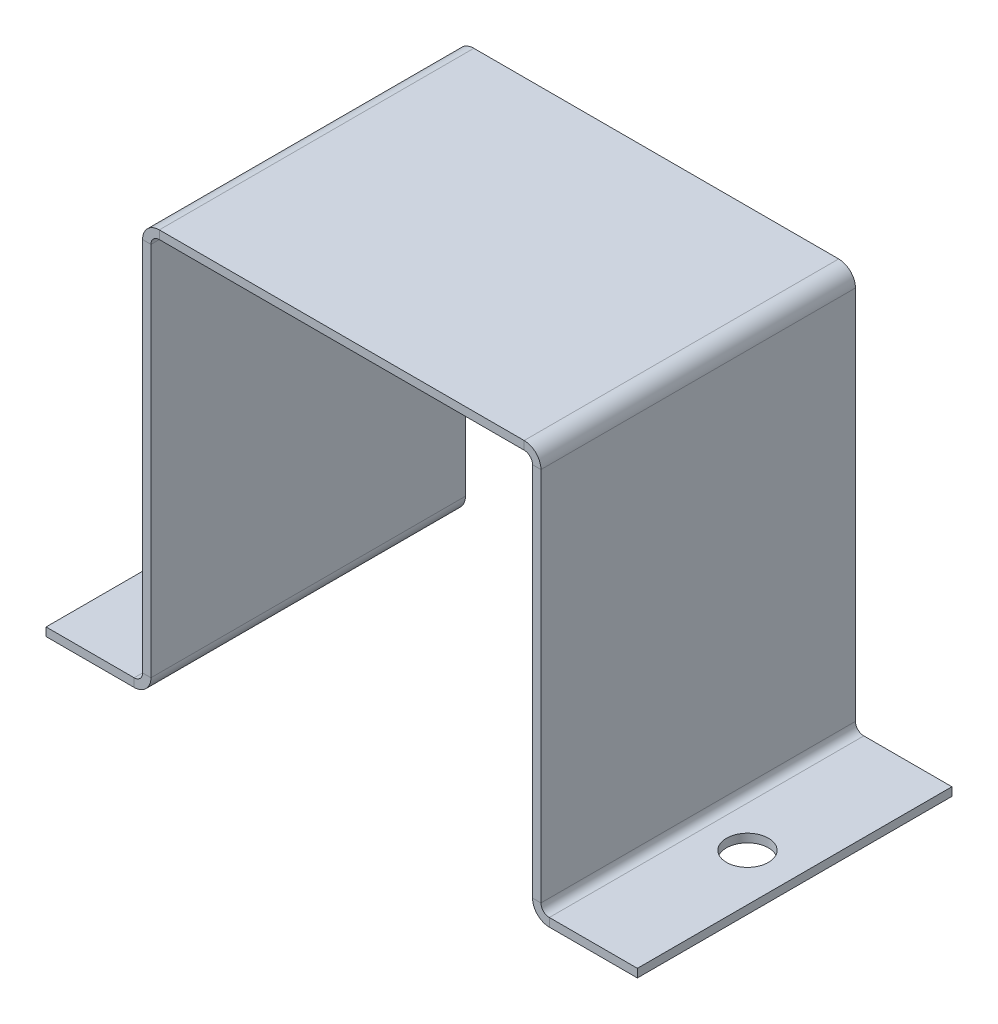
ISO-10303-21;
HEADER;
FILE_DESCRIPTION(('STEP AP214'),'2;1');
FILE_NAME('part.step','',(''),(''),'','','');
FILE_SCHEMA(('AUTOMOTIVE_DESIGN { 1 0 10303 214 1 1 1 1 }'));
ENDSEC;
DATA;
#1=APPLICATION_CONTEXT('core data for automotive mechanical design processes');
#2=APPLICATION_PROTOCOL_DEFINITION('international standard','automotive_design',2000,#1);
#3=PRODUCT_CONTEXT('',#1,'mechanical');
#4=PRODUCT('Part','Part','',(#3));
#5=PRODUCT_RELATED_PRODUCT_CATEGORY('part','',(#4));
#6=PRODUCT_DEFINITION_FORMATION('','',#4);
#7=PRODUCT_DEFINITION_CONTEXT('part definition',#1,'design');
#8=PRODUCT_DEFINITION('design','',#6,#7);
#9=PRODUCT_DEFINITION_SHAPE('','',#8);
#10=(LENGTH_UNIT() NAMED_UNIT(*) SI_UNIT(.MILLI.,.METRE.));
#11=(NAMED_UNIT(*) PLANE_ANGLE_UNIT() SI_UNIT($,.RADIAN.));
#12=(NAMED_UNIT(*) SI_UNIT($,.STERADIAN.) SOLID_ANGLE_UNIT());
#13=UNCERTAINTY_MEASURE_WITH_UNIT(LENGTH_MEASURE(1.E-05),#10,'distance_accuracy_value','');
#14=(GEOMETRIC_REPRESENTATION_CONTEXT(3) GLOBAL_UNCERTAINTY_ASSIGNED_CONTEXT((#13)) GLOBAL_UNIT_ASSIGNED_CONTEXT((#10,
#11,#12)) REPRESENTATION_CONTEXT('',''));
#15=CARTESIAN_POINT('',(0.,0.,0.));
#16=DIRECTION('',(0.,0.,1.));
#17=DIRECTION('',(1.,0.,0.));
#18=AXIS2_PLACEMENT_3D('',#15,#16,#17);
#19=CARTESIAN_POINT('',(19.,-0.799999999999997,-15.));
#20=DIRECTION('',(0.,0.,-1.));
#21=DIRECTION('',(-1.,0.,0.));
#22=AXIS2_PLACEMENT_3D('',#19,#20,#21);
#23=PLANE('',#22);
#24=DIRECTION('',(0.,1.,0.));
#25=VECTOR('',#24,1.);
#26=CARTESIAN_POINT('',(19.,-0.799999999999997,-15.));
#27=LINE('',#26,#25);
#28=CARTESIAN_POINT('',(19.,-1.59999999999999,-15.));
#29=VERTEX_POINT('',#28);
#30=CARTESIAN_POINT('',(19.0000000000001,-37.4,-15.));
#31=VERTEX_POINT('',#30);
#32=EDGE_CURVE('E383',#29,#31,#27,.F.);
#33=ORIENTED_EDGE('',*,*,#32,.T.);
#34=DIRECTION('',(-1.,0.,0.));
#35=VECTOR('',#34,1.);
#36=CARTESIAN_POINT('',(19.0000000000001,-37.4,-15.));
#37=LINE('',#36,#35);
#38=CARTESIAN_POINT('',(18.2000000000001,-37.4,-15.));
#39=VERTEX_POINT('',#38);
#40=EDGE_CURVE('E314',#31,#39,#37,.T.);
#41=ORIENTED_EDGE('',*,*,#40,.T.);
#42=DIRECTION('',(0.,-1.,0.));
#43=VECTOR('',#42,1.);
#44=CARTESIAN_POINT('',(18.2000000000001,-39.,-15.));
#45=LINE('',#44,#43);
#46=CARTESIAN_POINT('',(18.2,-1.6,-15.));
#47=VERTEX_POINT('',#46);
#48=EDGE_CURVE('E388',#47,#39,#45,.T.);
#49=ORIENTED_EDGE('',*,*,#48,.F.);
#50=DIRECTION('',(1.,0.,0.));
#51=VECTOR('',#50,1.);
#52=CARTESIAN_POINT('',(19.,-1.59999999999999,-15.));
#53=LINE('',#52,#51);
#54=EDGE_CURVE('E378',#47,#29,#53,.T.);
#55=ORIENTED_EDGE('',*,*,#54,.T.);
#56=EDGE_LOOP('',(#33,#41,#49,#55));
#57=FACE_BOUND('',#56,.T.);
#58=ADVANCED_FACE('F126',(#57),#23,.T.);
#59=CARTESIAN_POINT('',(19.0000000000001,-39.,-15.));
#60=DIRECTION('',(-1.,0.,0.));
#61=DIRECTION('',(0.,-1.,0.));
#62=AXIS2_PLACEMENT_3D('',#59,#60,#61);
#63=PLANE('',#62);
#64=DIRECTION('',(0.,0.,-1.));
#65=VECTOR('',#64,1.);
#66=CARTESIAN_POINT('',(19.0000000000001,-37.4,-15.));
#67=LINE('',#66,#65);
#68=CARTESIAN_POINT('',(19.0000000000001,-37.4,15.));
#69=VERTEX_POINT('',#68);
#70=EDGE_CURVE('E320',#31,#69,#67,.F.);
#71=ORIENTED_EDGE('',*,*,#70,.F.);
#72=ORIENTED_EDGE('',*,*,#32,.F.);
#73=DIRECTION('',(0.,0.,1.));
#74=VECTOR('',#73,1.);
#75=CARTESIAN_POINT('',(19.,-1.59999999999999,-15.));
#76=LINE('',#75,#74);
#77=CARTESIAN_POINT('',(19.,-1.59999999999999,15.));
#78=VERTEX_POINT('',#77);
#79=EDGE_CURVE('E391',#78,#29,#76,.F.);
#80=ORIENTED_EDGE('',*,*,#79,.F.);
#81=DIRECTION('',(0.,-1.,0.));
#82=VECTOR('',#81,1.);
#83=CARTESIAN_POINT('',(19.0000000000001,-39.,15.));
#84=LINE('',#83,#82);
#85=EDGE_CURVE('E380',#69,#78,#84,.F.);
#86=ORIENTED_EDGE('',*,*,#85,.F.);
#87=EDGE_LOOP('',(#71,#72,#80,#86));
#88=FACE_BOUND('',#87,.T.);
#89=ADVANCED_FACE('F494',(#88),#63,.F.);
#90=CARTESIAN_POINT('',(18.2000000000001,-39.,-15.));
#91=DIRECTION('',(-1.,0.,0.));
#92=DIRECTION('',(0.,-1.,0.));
#93=AXIS2_PLACEMENT_3D('',#90,#91,#92);
#94=PLANE('',#93);
#95=ORIENTED_EDGE('',*,*,#48,.T.);
#96=DIRECTION('',(0.,0.,-1.));
#97=VECTOR('',#96,1.);
#98=CARTESIAN_POINT('',(18.2000000000001,-37.4,-15.));
#99=LINE('',#98,#97);
#100=CARTESIAN_POINT('',(18.2000000000001,-37.4,15.));
#101=VERTEX_POINT('',#100);
#102=EDGE_CURVE('E309',#39,#101,#99,.F.);
#103=ORIENTED_EDGE('',*,*,#102,.T.);
#104=DIRECTION('',(0.,1.,0.));
#105=VECTOR('',#104,1.);
#106=CARTESIAN_POINT('',(18.2000000000001,-39.,15.));
#107=LINE('',#106,#105);
#108=CARTESIAN_POINT('',(18.2,-1.6,15.));
#109=VERTEX_POINT('',#108);
#110=EDGE_CURVE('E386',#101,#109,#107,.T.);
#111=ORIENTED_EDGE('',*,*,#110,.T.);
#112=DIRECTION('',(0.,0.,1.));
#113=VECTOR('',#112,1.);
#114=CARTESIAN_POINT('',(18.2,-1.6,-15.));
#115=LINE('',#114,#113);
#116=EDGE_CURVE('E396',#47,#109,#115,.T.);
#117=ORIENTED_EDGE('',*,*,#116,.F.);
#118=EDGE_LOOP('',(#95,#103,#111,#117));
#119=FACE_BOUND('',#118,.T.);
#120=ADVANCED_FACE('F502',(#119),#94,.T.);
#121=CARTESIAN_POINT('',(-19.0000000000001,-39.,15.));
#122=DIRECTION('',(0.,0.,1.));
#123=DIRECTION('',(1.,0.,0.));
#124=AXIS2_PLACEMENT_3D('',#121,#122,#123);
#125=PLANE('',#124);
#126=DIRECTION('',(0.,-1.,0.));
#127=VECTOR('',#126,1.);
#128=CARTESIAN_POINT('',(-19.0000000000001,-39.,15.));
#129=LINE('',#128,#127);
#130=CARTESIAN_POINT('',(-19.,-1.59999999999999,15.));
#131=VERTEX_POINT('',#130);
#132=CARTESIAN_POINT('',(-19.0000000000001,-37.4,15.));
#133=VERTEX_POINT('',#132);
#134=EDGE_CURVE('E427',#131,#133,#129,.T.);
#135=ORIENTED_EDGE('',*,*,#134,.T.);
#136=DIRECTION('',(1.,0.,0.));
#137=VECTOR('',#136,1.);
#138=CARTESIAN_POINT('',(-19.0000000000001,-37.4,15.));
#139=LINE('',#138,#137);
#140=CARTESIAN_POINT('',(-18.2000000000001,-37.4,15.));
#141=VERTEX_POINT('',#140);
#142=EDGE_CURVE('E366',#133,#141,#139,.T.);
#143=ORIENTED_EDGE('',*,*,#142,.T.);
#144=DIRECTION('',(0.,1.,0.));
#145=VECTOR('',#144,1.);
#146=CARTESIAN_POINT('',(-18.2,-0.8,15.));
#147=LINE('',#146,#145);
#148=CARTESIAN_POINT('',(-18.2,-1.6,15.));
#149=VERTEX_POINT('',#148);
#150=EDGE_CURVE('E432',#149,#141,#147,.F.);
#151=ORIENTED_EDGE('',*,*,#150,.F.);
#152=DIRECTION('',(-1.,0.,0.));
#153=VECTOR('',#152,1.);
#154=CARTESIAN_POINT('',(-19.,-1.6,15.));
#155=LINE('',#154,#153);
#156=EDGE_CURVE('E421',#149,#131,#155,.T.);
#157=ORIENTED_EDGE('',*,*,#156,.T.);
#158=EDGE_LOOP('',(#135,#143,#151,#157));
#159=FACE_BOUND('',#158,.T.);
#160=ADVANCED_FACE('F525',(#159),#125,.T.);
#161=CARTESIAN_POINT('',(-19.,-0.799999999999997,-15.));
#162=DIRECTION('',(-1.,0.,0.));
#163=DIRECTION('',(0.,-1.,0.));
#164=AXIS2_PLACEMENT_3D('',#161,#162,#163);
#165=PLANE('',#164);
#166=DIRECTION('',(0.,1.,0.));
#167=VECTOR('',#166,1.);
#168=CARTESIAN_POINT('',(-19.,-0.799999999999997,-15.));
#169=LINE('',#168,#167);
#170=CARTESIAN_POINT('',(-19.0000000000001,-37.4,-15.));
#171=VERTEX_POINT('',#170);
#172=CARTESIAN_POINT('',(-19.,-1.59999999999999,-15.));
#173=VERTEX_POINT('',#172);
#174=EDGE_CURVE('E424',#171,#173,#169,.T.);
#175=ORIENTED_EDGE('',*,*,#174,.F.);
#176=DIRECTION('',(0.,0.,1.));
#177=VECTOR('',#176,1.);
#178=CARTESIAN_POINT('',(-19.0000000000001,-37.4,15.));
#179=LINE('',#178,#177);
#180=EDGE_CURVE('E372',#133,#171,#179,.F.);
#181=ORIENTED_EDGE('',*,*,#180,.F.);
#182=ORIENTED_EDGE('',*,*,#134,.F.);
#183=DIRECTION('',(0.,0.,-1.));
#184=VECTOR('',#183,1.);
#185=CARTESIAN_POINT('',(-19.,-1.59999999999999,-15.));
#186=LINE('',#185,#184);
#187=EDGE_CURVE('E435',#131,#173,#186,.T.);
#188=ORIENTED_EDGE('',*,*,#187,.T.);
#189=EDGE_LOOP('',(#175,#181,#182,#188));
#190=FACE_BOUND('',#189,.T.);
#191=ADVANCED_FACE('F589',(#190),#165,.T.);
#192=CARTESIAN_POINT('',(-18.2,-0.8,-15.));
#193=DIRECTION('',(-1.,0.,0.));
#194=DIRECTION('',(0.,-1.,0.));
#195=AXIS2_PLACEMENT_3D('',#192,#193,#194);
#196=PLANE('',#195);
#197=DIRECTION('',(0.,0.,1.));
#198=VECTOR('',#197,1.);
#199=CARTESIAN_POINT('',(-18.2000000000001,-37.4,15.));
#200=LINE('',#199,#198);
#201=CARTESIAN_POINT('',(-18.2000000000001,-37.4,-15.));
#202=VERTEX_POINT('',#201);
#203=EDGE_CURVE('E360',#141,#202,#200,.F.);
#204=ORIENTED_EDGE('',*,*,#203,.T.);
#205=DIRECTION('',(0.,-1.,0.));
#206=VECTOR('',#205,1.);
#207=CARTESIAN_POINT('',(-18.2,-0.8,-15.));
#208=LINE('',#207,#206);
#209=CARTESIAN_POINT('',(-18.2,-1.6,-15.));
#210=VERTEX_POINT('',#209);
#211=EDGE_CURVE('E430',#202,#210,#208,.F.);
#212=ORIENTED_EDGE('',*,*,#211,.T.);
#213=DIRECTION('',(0.,0.,1.));
#214=VECTOR('',#213,1.);
#215=CARTESIAN_POINT('',(-18.2,-1.6,15.));
#216=LINE('',#215,#214);
#217=EDGE_CURVE('E441',#149,#210,#216,.F.);
#218=ORIENTED_EDGE('',*,*,#217,.F.);
#219=ORIENTED_EDGE('',*,*,#150,.T.);
#220=EDGE_LOOP('',(#204,#212,#218,#219));
#221=FACE_BOUND('',#220,.T.);
#222=ADVANCED_FACE('F522',(#221),#196,.F.);
#223=CARTESIAN_POINT('',(19.,-0.8,-15.));
#224=DIRECTION('',(0.,-1.,0.));
#225=DIRECTION('',(0.,0.,-1.));
#226=AXIS2_PLACEMENT_3D('',#223,#224,#225);
#227=PLANE('',#226);
#228=DIRECTION('',(-1.,0.,0.));
#229=VECTOR('',#228,1.);
#230=CARTESIAN_POINT('',(-19.,-0.8,-15.));
#231=LINE('',#230,#229);
#232=CARTESIAN_POINT('',(17.4,-0.800000000000002,-15.));
#233=VERTEX_POINT('',#232);
#234=CARTESIAN_POINT('',(-17.4,-0.8,-15.));
#235=VERTEX_POINT('',#234);
#236=EDGE_CURVE('E135',#233,#235,#231,.T.);
#237=ORIENTED_EDGE('',*,*,#236,.F.);
#238=DIRECTION('',(0.,0.,1.));
#239=VECTOR('',#238,1.);
#240=CARTESIAN_POINT('',(17.4,-0.800000000000002,15.));
#241=LINE('',#240,#239);
#242=CARTESIAN_POINT('',(17.4,-0.800000000000002,15.));
#243=VERTEX_POINT('',#242);
#244=EDGE_CURVE('E413',#243,#233,#241,.F.);
#245=ORIENTED_EDGE('',*,*,#244,.F.);
#246=DIRECTION('',(1.,0.,0.));
#247=VECTOR('',#246,1.);
#248=CARTESIAN_POINT('',(-19.,-0.8,15.));
#249=LINE('',#248,#247);
#250=CARTESIAN_POINT('',(-17.4,-0.8,15.));
#251=VERTEX_POINT('',#250);
#252=EDGE_CURVE('E15',#251,#243,#249,.T.);
#253=ORIENTED_EDGE('',*,*,#252,.F.);
#254=DIRECTION('',(0.,0.,-1.));
#255=VECTOR('',#254,1.);
#256=CARTESIAN_POINT('',(-17.4,-0.800000000000002,-15.));
#257=LINE('',#256,#255);
#258=EDGE_CURVE('E458',#235,#251,#257,.F.);
#259=ORIENTED_EDGE('',*,*,#258,.F.);
#260=EDGE_LOOP('',(#237,#245,#253,#259));
#261=FACE_BOUND('',#260,.T.);
#262=ADVANCED_FACE('F507',(#261),#227,.T.);
#263=CARTESIAN_POINT('',(19.,0.,-15.));
#264=DIRECTION('',(0.,-1.,0.));
#265=DIRECTION('',(0.,0.,-1.));
#266=AXIS2_PLACEMENT_3D('',#263,#264,#265);
#267=PLANE('',#266);
#268=DIRECTION('',(0.,0.,1.));
#269=VECTOR('',#268,1.);
#270=CARTESIAN_POINT('',(17.4,0.,15.));
#271=LINE('',#270,#269);
#272=CARTESIAN_POINT('',(17.4,0.,15.));
#273=VERTEX_POINT('',#272);
#274=CARTESIAN_POINT('',(17.4,0.,-15.));
#275=VERTEX_POINT('',#274);
#276=EDGE_CURVE('E401',#273,#275,#271,.F.);
#277=ORIENTED_EDGE('',*,*,#276,.T.);
#278=DIRECTION('',(-1.,0.,0.));
#279=VECTOR('',#278,1.);
#280=CARTESIAN_POINT('',(-19.,0.,-15.));
#281=LINE('',#280,#279);
#282=CARTESIAN_POINT('',(-17.4,0.,-15.));
#283=VERTEX_POINT('',#282);
#284=EDGE_CURVE('E466',#275,#283,#281,.T.);
#285=ORIENTED_EDGE('',*,*,#284,.T.);
#286=DIRECTION('',(0.,0.,-1.));
#287=VECTOR('',#286,1.);
#288=CARTESIAN_POINT('',(-17.4,0.,-15.));
#289=LINE('',#288,#287);
#290=CARTESIAN_POINT('',(-17.4,0.,15.));
#291=VERTEX_POINT('',#290);
#292=EDGE_CURVE('E446',#283,#291,#289,.F.);
#293=ORIENTED_EDGE('',*,*,#292,.T.);
#294=DIRECTION('',(1.,0.,0.));
#295=VECTOR('',#294,1.);
#296=CARTESIAN_POINT('',(-19.,0.,15.));
#297=LINE('',#296,#295);
#298=EDGE_CURVE('E130',#291,#273,#297,.T.);
#299=ORIENTED_EDGE('',*,*,#298,.T.);
#300=EDGE_LOOP('',(#277,#285,#293,#299));
#301=FACE_BOUND('',#300,.T.);
#302=ADVANCED_FACE('F473',(#301),#267,.F.);
#303=CARTESIAN_POINT('',(-19.,-0.8,15.));
#304=DIRECTION('',(0.,0.,1.));
#305=DIRECTION('',(1.,0.,0.));
#306=AXIS2_PLACEMENT_3D('',#303,#304,#305);
#307=PLANE('',#306);
#308=ORIENTED_EDGE('',*,*,#252,.T.);
#309=DIRECTION('',(0.,1.,0.));
#310=VECTOR('',#309,1.);
#311=CARTESIAN_POINT('',(17.4,-0.800000000000002,15.));
#312=LINE('',#311,#310);
#313=EDGE_CURVE('E407',#243,#273,#312,.T.);
#314=ORIENTED_EDGE('',*,*,#313,.T.);
#315=ORIENTED_EDGE('',*,*,#298,.F.);
#316=DIRECTION('',(0.,1.,0.));
#317=VECTOR('',#316,1.);
#318=CARTESIAN_POINT('',(-17.4,-0.800000000000002,15.));
#319=LINE('',#318,#317);
#320=EDGE_CURVE('E463',#251,#291,#319,.T.);
#321=ORIENTED_EDGE('',*,*,#320,.F.);
#322=EDGE_LOOP('',(#308,#314,#315,#321));
#323=FACE_BOUND('',#322,.T.);
#324=ADVANCED_FACE('F477',(#323),#307,.T.);
#325=CARTESIAN_POINT('',(-19.,-0.8,-15.));
#326=DIRECTION('',(0.,0.,-1.));
#327=DIRECTION('',(-1.,0.,0.));
#328=AXIS2_PLACEMENT_3D('',#325,#326,#327);
#329=PLANE('',#328);
#330=DIRECTION('',(0.,1.,0.));
#331=VECTOR('',#330,1.);
#332=CARTESIAN_POINT('',(17.4,-0.800000000000002,-15.));
#333=LINE('',#332,#331);
#334=EDGE_CURVE('E418',#233,#275,#333,.T.);
#335=ORIENTED_EDGE('',*,*,#334,.F.);
#336=ORIENTED_EDGE('',*,*,#236,.T.);
#337=DIRECTION('',(0.,1.,0.));
#338=VECTOR('',#337,1.);
#339=CARTESIAN_POINT('',(-17.4,-0.800000000000002,-15.));
#340=LINE('',#339,#338);
#341=EDGE_CURVE('E452',#235,#283,#340,.T.);
#342=ORIENTED_EDGE('',*,*,#341,.T.);
#343=ORIENTED_EDGE('',*,*,#284,.F.);
#344=EDGE_LOOP('',(#335,#336,#342,#343));
#345=FACE_BOUND('',#344,.T.);
#346=ADVANCED_FACE('F128',(#345),#329,.T.);
#347=CARTESIAN_POINT('',(-17.4,-1.6,15.));
#348=DIRECTION('',(0.,0.,1.));
#349=DIRECTION('',(1.,0.,0.));
#350=AXIS2_PLACEMENT_3D('',#347,#348,#349);
#351=PLANE('',#350);
#352=ORIENTED_EDGE('',*,*,#156,.F.);
#353=CARTESIAN_POINT('',(-17.4,-1.6,15.));
#354=DIRECTION('',(0.,0.,-1.));
#355=DIRECTION('',(-1.,0.,0.));
#356=AXIS2_PLACEMENT_3D('',#353,#354,#355);
#357=CIRCLE('',#356,0.799999999999999);
#358=EDGE_CURVE('E455',#251,#149,#357,.F.);
#359=ORIENTED_EDGE('',*,*,#358,.F.);
#360=ORIENTED_EDGE('',*,*,#320,.T.);
#361=CARTESIAN_POINT('',(-17.4,-1.6,15.));
#362=DIRECTION('',(0.,0.,-1.));
#363=DIRECTION('',(-1.,0.,0.));
#364=AXIS2_PLACEMENT_3D('',#361,#362,#363);
#365=CIRCLE('',#364,1.6);
#366=EDGE_CURVE('E448',#291,#131,#365,.F.);
#367=ORIENTED_EDGE('',*,*,#366,.T.);
#368=EDGE_LOOP('',(#352,#359,#360,#367));
#369=FACE_BOUND('',#368,.T.);
#370=ADVANCED_FACE('F603',(#369),#351,.T.);
#371=CARTESIAN_POINT('',(-17.4,-1.6,-15.));
#372=DIRECTION('',(0.,0.,1.));
#373=DIRECTION('',(1.,0.,0.));
#374=AXIS2_PLACEMENT_3D('',#371,#372,#373);
#375=PLANE('',#374);
#376=CARTESIAN_POINT('',(-17.4,-1.6,-15.));
#377=DIRECTION('',(0.,0.,-1.));
#378=DIRECTION('',(-1.,0.,0.));
#379=AXIS2_PLACEMENT_3D('',#376,#377,#378);
#380=CIRCLE('',#379,0.799999999999999);
#381=EDGE_CURVE('E426',#210,#235,#380,.T.);
#382=ORIENTED_EDGE('',*,*,#381,.F.);
#383=DIRECTION('',(-1.,0.,0.));
#384=VECTOR('',#383,1.);
#385=CARTESIAN_POINT('',(-18.2,-1.6,-15.));
#386=LINE('',#385,#384);
#387=EDGE_CURVE('E438',#210,#173,#386,.T.);
#388=ORIENTED_EDGE('',*,*,#387,.T.);
#389=CARTESIAN_POINT('',(-17.4,-1.6,-15.));
#390=DIRECTION('',(0.,0.,-1.));
#391=DIRECTION('',(-1.,0.,0.));
#392=AXIS2_PLACEMENT_3D('',#389,#390,#391);
#393=CIRCLE('',#392,1.6);
#394=EDGE_CURVE('E449',#173,#283,#393,.T.);
#395=ORIENTED_EDGE('',*,*,#394,.T.);
#396=ORIENTED_EDGE('',*,*,#341,.F.);
#397=EDGE_LOOP('',(#382,#388,#395,#396));
#398=FACE_BOUND('',#397,.T.);
#399=ADVANCED_FACE('F513',(#398),#375,.F.);
#400=CARTESIAN_POINT('',(-17.4,-1.6,-15.));
#401=DIRECTION('',(0.,0.,-1.));
#402=DIRECTION('',(-1.,0.,0.));
#403=AXIS2_PLACEMENT_3D('',#400,#401,#402);
#404=CYLINDRICAL_SURFACE('',#403,1.6);
#405=ORIENTED_EDGE('',*,*,#292,.F.);
#406=ORIENTED_EDGE('',*,*,#394,.F.);
#407=ORIENTED_EDGE('',*,*,#187,.F.);
#408=ORIENTED_EDGE('',*,*,#366,.F.);
#409=EDGE_LOOP('',(#405,#406,#407,#408));
#410=FACE_BOUND('',#409,.T.);
#411=ADVANCED_FACE('F599',(#410),#404,.T.);
#412=CARTESIAN_POINT('',(-17.4,-1.6,-15.));
#413=DIRECTION('',(0.,0.,-1.));
#414=DIRECTION('',(-1.,0.,0.));
#415=AXIS2_PLACEMENT_3D('',#412,#413,#414);
#416=CYLINDRICAL_SURFACE('',#415,0.799999999999999);
#417=ORIENTED_EDGE('',*,*,#258,.T.);
#418=ORIENTED_EDGE('',*,*,#358,.T.);
#419=ORIENTED_EDGE('',*,*,#217,.T.);
#420=ORIENTED_EDGE('',*,*,#381,.T.);
#421=EDGE_LOOP('',(#417,#418,#419,#420));
#422=FACE_BOUND('',#421,.T.);
#423=ADVANCED_FACE('F517',(#422),#416,.F.);
#424=CARTESIAN_POINT('',(-19.,-0.799999999999997,-15.));
#425=DIRECTION('',(0.,0.,-1.));
#426=DIRECTION('',(-1.,0.,0.));
#427=AXIS2_PLACEMENT_3D('',#424,#425,#426);
#428=PLANE('',#427);
#429=DIRECTION('',(1.,0.,0.));
#430=VECTOR('',#429,1.);
#431=CARTESIAN_POINT('',(-19.0000000000001,-37.4,-15.));
#432=LINE('',#431,#430);
#433=EDGE_CURVE('E151',#171,#202,#432,.T.);
#434=ORIENTED_EDGE('',*,*,#433,.F.);
#435=ORIENTED_EDGE('',*,*,#174,.T.);
#436=ORIENTED_EDGE('',*,*,#387,.F.);
#437=ORIENTED_EDGE('',*,*,#211,.F.);
#438=EDGE_LOOP('',(#434,#435,#436,#437));
#439=FACE_BOUND('',#438,.T.);
#440=ADVANCED_FACE('F586',(#439),#428,.T.);
#441=CARTESIAN_POINT('',(17.4,-1.6,-15.));
#442=DIRECTION('',(0.,0.,-1.));
#443=DIRECTION('',(-1.,0.,0.));
#444=AXIS2_PLACEMENT_3D('',#441,#442,#443);
#445=PLANE('',#444);
#446=ORIENTED_EDGE('',*,*,#54,.F.);
#447=CARTESIAN_POINT('',(17.4,-1.6,-15.));
#448=DIRECTION('',(0.,0.,1.));
#449=DIRECTION('',(1.,0.,0.));
#450=AXIS2_PLACEMENT_3D('',#447,#448,#449);
#451=CIRCLE('',#450,0.799999999999999);
#452=EDGE_CURVE('E410',#233,#47,#451,.F.);
#453=ORIENTED_EDGE('',*,*,#452,.F.);
#454=ORIENTED_EDGE('',*,*,#334,.T.);
#455=CARTESIAN_POINT('',(17.4,-1.6,-15.));
#456=DIRECTION('',(0.,0.,1.));
#457=DIRECTION('',(1.,0.,0.));
#458=AXIS2_PLACEMENT_3D('',#455,#456,#457);
#459=CIRCLE('',#458,1.6);
#460=EDGE_CURVE('E403',#275,#29,#459,.F.);
#461=ORIENTED_EDGE('',*,*,#460,.T.);
#462=EDGE_LOOP('',(#446,#453,#454,#461));
#463=FACE_BOUND('',#462,.T.);
#464=ADVANCED_FACE('F496',(#463),#445,.T.);
#465=CARTESIAN_POINT('',(17.4,-1.6,15.));
#466=DIRECTION('',(0.,0.,-1.));
#467=DIRECTION('',(-1.,0.,0.));
#468=AXIS2_PLACEMENT_3D('',#465,#466,#467);
#469=PLANE('',#468);
#470=CARTESIAN_POINT('',(17.4,-1.6,15.));
#471=DIRECTION('',(0.,0.,1.));
#472=DIRECTION('',(1.,0.,0.));
#473=AXIS2_PLACEMENT_3D('',#470,#471,#472);
#474=CIRCLE('',#473,0.799999999999999);
#475=EDGE_CURVE('E382',#109,#243,#474,.T.);
#476=ORIENTED_EDGE('',*,*,#475,.F.);
#477=DIRECTION('',(1.,0.,0.));
#478=VECTOR('',#477,1.);
#479=CARTESIAN_POINT('',(18.2,-1.6,15.));
#480=LINE('',#479,#478);
#481=EDGE_CURVE('E393',#109,#78,#480,.T.);
#482=ORIENTED_EDGE('',*,*,#481,.T.);
#483=CARTESIAN_POINT('',(17.4,-1.6,15.));
#484=DIRECTION('',(0.,0.,1.));
#485=DIRECTION('',(1.,0.,0.));
#486=AXIS2_PLACEMENT_3D('',#483,#484,#485);
#487=CIRCLE('',#486,1.6);
#488=EDGE_CURVE('E404',#78,#273,#487,.T.);
#489=ORIENTED_EDGE('',*,*,#488,.T.);
#490=ORIENTED_EDGE('',*,*,#313,.F.);
#491=EDGE_LOOP('',(#476,#482,#489,#490));
#492=FACE_BOUND('',#491,.T.);
#493=ADVANCED_FACE('F485',(#492),#469,.F.);
#494=CARTESIAN_POINT('',(17.4,-1.6,15.));
#495=DIRECTION('',(0.,0.,1.));
#496=DIRECTION('',(1.,0.,0.));
#497=AXIS2_PLACEMENT_3D('',#494,#495,#496);
#498=CYLINDRICAL_SURFACE('',#497,1.6);
#499=ORIENTED_EDGE('',*,*,#276,.F.);
#500=ORIENTED_EDGE('',*,*,#488,.F.);
#501=ORIENTED_EDGE('',*,*,#79,.T.);
#502=ORIENTED_EDGE('',*,*,#460,.F.);
#503=EDGE_LOOP('',(#499,#500,#501,#502));
#504=FACE_BOUND('',#503,.T.);
#505=ADVANCED_FACE('F484',(#504),#498,.T.);
#506=CARTESIAN_POINT('',(17.4,-1.6,15.));
#507=DIRECTION('',(0.,0.,1.));
#508=DIRECTION('',(1.,0.,0.));
#509=AXIS2_PLACEMENT_3D('',#506,#507,#508);
#510=CYLINDRICAL_SURFACE('',#509,0.799999999999999);
#511=ORIENTED_EDGE('',*,*,#244,.T.);
#512=ORIENTED_EDGE('',*,*,#452,.T.);
#513=ORIENTED_EDGE('',*,*,#116,.T.);
#514=ORIENTED_EDGE('',*,*,#475,.T.);
#515=EDGE_LOOP('',(#511,#512,#513,#514));
#516=FACE_BOUND('',#515,.T.);
#517=ADVANCED_FACE('F504',(#516),#510,.F.);
#518=CARTESIAN_POINT('',(19.0000000000001,-39.,15.));
#519=DIRECTION('',(0.,0.,1.));
#520=DIRECTION('',(1.,0.,0.));
#521=AXIS2_PLACEMENT_3D('',#518,#519,#520);
#522=PLANE('',#521);
#523=DIRECTION('',(-1.,0.,0.));
#524=VECTOR('',#523,1.);
#525=CARTESIAN_POINT('',(19.0000000000001,-37.4,15.));
#526=LINE('',#525,#524);
#527=EDGE_CURVE('E325',#69,#101,#526,.T.);
#528=ORIENTED_EDGE('',*,*,#527,.F.);
#529=ORIENTED_EDGE('',*,*,#85,.T.);
#530=ORIENTED_EDGE('',*,*,#481,.F.);
#531=ORIENTED_EDGE('',*,*,#110,.F.);
#532=EDGE_LOOP('',(#528,#529,#530,#531));
#533=FACE_BOUND('',#532,.T.);
#534=ADVANCED_FACE('F561',(#533),#522,.T.);
#535=CARTESIAN_POINT('',(-19.8000000000001,-37.4,-15.));
#536=DIRECTION('',(0.,0.,-1.));
#537=DIRECTION('',(-1.,0.,0.));
#538=AXIS2_PLACEMENT_3D('',#535,#536,#537);
#539=PLANE('',#538);
#540=DIRECTION('',(0.,1.,0.));
#541=VECTOR('',#540,1.);
#542=CARTESIAN_POINT('',(-19.8000000000001,-39.,-15.));
#543=LINE('',#542,#541);
#544=CARTESIAN_POINT('',(-19.8000000000001,-38.2,-15.));
#545=VERTEX_POINT('',#544);
#546=CARTESIAN_POINT('',(-19.8000000000001,-39.,-15.));
#547=VERTEX_POINT('',#546);
#548=EDGE_CURVE('E327',#545,#547,#543,.F.);
#549=ORIENTED_EDGE('',*,*,#548,.F.);
#550=CARTESIAN_POINT('',(-19.8000000000001,-37.4,-15.));
#551=DIRECTION('',(0.,0.,1.));
#552=DIRECTION('',(1.,0.,0.));
#553=AXIS2_PLACEMENT_3D('',#550,#551,#552);
#554=CIRCLE('',#553,0.799999999999995);
#555=EDGE_CURVE('E369',#171,#545,#554,.F.);
#556=ORIENTED_EDGE('',*,*,#555,.F.);
#557=ORIENTED_EDGE('',*,*,#433,.T.);
#558=CARTESIAN_POINT('',(-19.8000000000001,-37.4,-15.));
#559=DIRECTION('',(0.,0.,1.));
#560=DIRECTION('',(1.,0.,0.));
#561=AXIS2_PLACEMENT_3D('',#558,#559,#560);
#562=CIRCLE('',#561,1.59999999999999);
#563=EDGE_CURVE('E362',#202,#547,#562,.F.);
#564=ORIENTED_EDGE('',*,*,#563,.T.);
#565=EDGE_LOOP('',(#549,#556,#557,#564));
#566=FACE_BOUND('',#565,.T.);
#567=ADVANCED_FACE('F559',(#566),#539,.T.);
#568=CARTESIAN_POINT('',(-19.8000000000001,-37.4,15.));
#569=DIRECTION('',(0.,0.,-1.));
#570=DIRECTION('',(-1.,0.,0.));
#571=AXIS2_PLACEMENT_3D('',#568,#569,#570);
#572=PLANE('',#571);
#573=CARTESIAN_POINT('',(-19.8000000000001,-37.4,15.));
#574=DIRECTION('',(0.,0.,1.));
#575=DIRECTION('',(1.,0.,0.));
#576=AXIS2_PLACEMENT_3D('',#573,#574,#575);
#577=CIRCLE('',#576,0.799999999999995);
#578=CARTESIAN_POINT('',(-19.8000000000001,-38.2,15.));
#579=VERTEX_POINT('',#578);
#580=EDGE_CURVE('E333',#579,#133,#577,.T.);
#581=ORIENTED_EDGE('',*,*,#580,.F.);
#582=DIRECTION('',(0.,1.,0.));
#583=VECTOR('',#582,1.);
#584=CARTESIAN_POINT('',(-19.8000000000001,-38.2,15.));
#585=LINE('',#584,#583);
#586=CARTESIAN_POINT('',(-19.8000000000001,-39.,15.));
#587=VERTEX_POINT('',#586);
#588=EDGE_CURVE('E353',#579,#587,#585,.F.);
#589=ORIENTED_EDGE('',*,*,#588,.T.);
#590=CARTESIAN_POINT('',(-19.8000000000001,-37.4,15.));
#591=DIRECTION('',(0.,0.,1.));
#592=DIRECTION('',(1.,0.,0.));
#593=AXIS2_PLACEMENT_3D('',#590,#591,#592);
#594=CIRCLE('',#593,1.59999999999999);
#595=EDGE_CURVE('E363',#587,#141,#594,.T.);
#596=ORIENTED_EDGE('',*,*,#595,.T.);
#597=ORIENTED_EDGE('',*,*,#142,.F.);
#598=EDGE_LOOP('',(#581,#589,#596,#597));
#599=FACE_BOUND('',#598,.T.);
#600=ADVANCED_FACE('F530',(#599),#572,.F.);
#601=CARTESIAN_POINT('',(-19.8000000000001,-37.4,15.));
#602=DIRECTION('',(0.,0.,1.));
#603=DIRECTION('',(0.,-1.,0.));
#604=AXIS2_PLACEMENT_3D('',#601,#602,#603);
#605=CYLINDRICAL_SURFACE('',#604,1.59999999999999);
#606=ORIENTED_EDGE('',*,*,#203,.F.);
#607=ORIENTED_EDGE('',*,*,#595,.F.);
#608=DIRECTION('',(0.,0.,1.));
#609=VECTOR('',#608,1.);
#610=CARTESIAN_POINT('',(-19.8000000000001,-39.,-15.));
#611=LINE('',#610,#609);
#612=EDGE_CURVE('E351',#587,#547,#611,.F.);
#613=ORIENTED_EDGE('',*,*,#612,.T.);
#614=ORIENTED_EDGE('',*,*,#563,.F.);
#615=EDGE_LOOP('',(#606,#607,#613,#614));
#616=FACE_BOUND('',#615,.T.);
#617=ADVANCED_FACE('F557',(#616),#605,.T.);
#618=CARTESIAN_POINT('',(-19.8000000000001,-37.4,15.));
#619=DIRECTION('',(0.,0.,1.));
#620=DIRECTION('',(0.,-1.,0.));
#621=AXIS2_PLACEMENT_3D('',#618,#619,#620);
#622=CYLINDRICAL_SURFACE('',#621,0.799999999999995);
#623=ORIENTED_EDGE('',*,*,#180,.T.);
#624=ORIENTED_EDGE('',*,*,#555,.T.);
#625=DIRECTION('',(0.,0.,1.));
#626=VECTOR('',#625,1.);
#627=CARTESIAN_POINT('',(-19.8000000000001,-38.2,-15.));
#628=LINE('',#627,#626);
#629=EDGE_CURVE('E356',#545,#579,#628,.T.);
#630=ORIENTED_EDGE('',*,*,#629,.T.);
#631=ORIENTED_EDGE('',*,*,#580,.T.);
#632=EDGE_LOOP('',(#623,#624,#630,#631));
#633=FACE_BOUND('',#632,.T.);
#634=ADVANCED_FACE('F533',(#633),#622,.F.);
#635=CARTESIAN_POINT('',(-28.2000000000001,-39.,15.));
#636=DIRECTION('',(0.,0.,-1.));
#637=DIRECTION('',(-1.,0.,0.));
#638=AXIS2_PLACEMENT_3D('',#635,#636,#637);
#639=PLANE('',#638);
#640=ORIENTED_EDGE('',*,*,#588,.F.);
#641=DIRECTION('',(1.,0.,0.));
#642=VECTOR('',#641,1.);
#643=CARTESIAN_POINT('',(-28.2000000000001,-38.2,15.));
#644=LINE('',#643,#642);
#645=CARTESIAN_POINT('',(-28.2000000000001,-38.2,15.));
#646=VERTEX_POINT('',#645);
#647=EDGE_CURVE('E349',#579,#646,#644,.F.);
#648=ORIENTED_EDGE('',*,*,#647,.T.);
#649=DIRECTION('',(0.,1.,0.));
#650=VECTOR('',#649,1.);
#651=CARTESIAN_POINT('',(-28.2000000000001,-39.,15.));
#652=LINE('',#651,#650);
#653=CARTESIAN_POINT('',(-28.2000000000001,-39.,15.));
#654=VERTEX_POINT('',#653);
#655=EDGE_CURVE('E330',#654,#646,#652,.T.);
#656=ORIENTED_EDGE('',*,*,#655,.F.);
#657=DIRECTION('',(-1.,0.,0.));
#658=VECTOR('',#657,1.);
#659=CARTESIAN_POINT('',(-19.0000000000001,-39.,15.));
#660=LINE('',#659,#658);
#661=EDGE_CURVE('E342',#587,#654,#660,.T.);
#662=ORIENTED_EDGE('',*,*,#661,.F.);
#663=EDGE_LOOP('',(#640,#648,#656,#662));
#664=FACE_BOUND('',#663,.T.);
#665=ADVANCED_FACE('F551',(#664),#639,.F.);
#666=CARTESIAN_POINT('',(-19.0000000000001,-39.,-15.));
#667=DIRECTION('',(0.,0.,1.));
#668=DIRECTION('',(1.,0.,0.));
#669=AXIS2_PLACEMENT_3D('',#666,#667,#668);
#670=PLANE('',#669);
#671=ORIENTED_EDGE('',*,*,#548,.T.);
#672=DIRECTION('',(1.,0.,0.));
#673=VECTOR('',#672,1.);
#674=CARTESIAN_POINT('',(-19.0000000000001,-39.,-15.));
#675=LINE('',#674,#673);
#676=CARTESIAN_POINT('',(-28.2000000000001,-39.,-15.));
#677=VERTEX_POINT('',#676);
#678=EDGE_CURVE('E337',#677,#547,#675,.T.);
#679=ORIENTED_EDGE('',*,*,#678,.F.);
#680=DIRECTION('',(0.,1.,0.));
#681=VECTOR('',#680,1.);
#682=CARTESIAN_POINT('',(-28.2000000000001,-39.,-15.));
#683=LINE('',#682,#681);
#684=CARTESIAN_POINT('',(-28.2000000000001,-38.2,-15.));
#685=VERTEX_POINT('',#684);
#686=EDGE_CURVE('E334',#677,#685,#683,.T.);
#687=ORIENTED_EDGE('',*,*,#686,.T.);
#688=DIRECTION('',(-1.,0.,0.));
#689=VECTOR('',#688,1.);
#690=CARTESIAN_POINT('',(-19.0000000000001,-38.2,-15.));
#691=LINE('',#690,#689);
#692=EDGE_CURVE('E344',#685,#545,#691,.F.);
#693=ORIENTED_EDGE('',*,*,#692,.T.);
#694=EDGE_LOOP('',(#671,#679,#687,#693));
#695=FACE_BOUND('',#694,.T.);
#696=ADVANCED_FACE('F542',(#695),#670,.F.);
#697=CARTESIAN_POINT('',(-19.0000000000001,-39.,15.));
#698=DIRECTION('',(0.,1.,0.));
#699=DIRECTION('',(0.,0.,1.));
#700=AXIS2_PLACEMENT_3D('',#697,#698,#699);
#701=PLANE('',#700);
#702=CARTESIAN_POINT('',(-23.7000000000001,-39.,0.));
#703=DIRECTION('',(0.,1.,0.));
#704=DIRECTION('',(0.,0.,1.));
#705=AXIS2_PLACEMENT_3D('',#702,#703,#704);
#706=CIRCLE('',#705,2.);
#707=CARTESIAN_POINT('',(-23.7000000000001,-39.,2.));
#708=VERTEX_POINT('',#707);
#709=EDGE_CURVE('E308',#708,#708,#706,.T.);
#710=ORIENTED_EDGE('',*,*,#709,.T.);
#711=EDGE_LOOP('',(#710));
#712=FACE_BOUND('',#711,.T.);
#713=ORIENTED_EDGE('',*,*,#612,.F.);
#714=ORIENTED_EDGE('',*,*,#661,.T.);
#715=DIRECTION('',(0.,0.,-1.));
#716=VECTOR('',#715,1.);
#717=CARTESIAN_POINT('',(-28.2000000000001,-39.,15.));
#718=LINE('',#717,#716);
#719=EDGE_CURVE('E340',#654,#677,#718,.T.);
#720=ORIENTED_EDGE('',*,*,#719,.T.);
#721=ORIENTED_EDGE('',*,*,#678,.T.);
#722=EDGE_LOOP('',(#713,#714,#720,#721));
#723=FACE_BOUND('',#722,.T.);
#724=ADVANCED_FACE('F554',(#712,#723),#701,.F.);
#725=CARTESIAN_POINT('',(-19.0000000000001,-38.2,15.));
#726=DIRECTION('',(0.,1.,0.));
#727=DIRECTION('',(0.,0.,1.));
#728=AXIS2_PLACEMENT_3D('',#725,#726,#727);
#729=PLANE('',#728);
#730=CARTESIAN_POINT('',(-23.7000000000001,-38.2,0.));
#731=DIRECTION('',(0.,1.,0.));
#732=DIRECTION('',(0.,0.,1.));
#733=AXIS2_PLACEMENT_3D('',#730,#731,#732);
#734=CIRCLE('',#733,2.);
#735=CARTESIAN_POINT('',(-23.7000000000001,-38.2,2.));
#736=VERTEX_POINT('',#735);
#737=EDGE_CURVE('E991',#736,#736,#734,.T.);
#738=ORIENTED_EDGE('',*,*,#737,.F.);
#739=EDGE_LOOP('',(#738));
#740=FACE_BOUND('',#739,.T.);
#741=ORIENTED_EDGE('',*,*,#647,.F.);
#742=ORIENTED_EDGE('',*,*,#629,.F.);
#743=ORIENTED_EDGE('',*,*,#692,.F.);
#744=DIRECTION('',(0.,0.,1.));
#745=VECTOR('',#744,1.);
#746=CARTESIAN_POINT('',(-28.2000000000001,-38.2,-15.));
#747=LINE('',#746,#745);
#748=EDGE_CURVE('E347',#646,#685,#747,.F.);
#749=ORIENTED_EDGE('',*,*,#748,.F.);
#750=EDGE_LOOP('',(#741,#742,#743,#749));
#751=FACE_BOUND('',#750,.T.);
#752=ADVANCED_FACE('F539',(#740,#751),#729,.T.);
#753=CARTESIAN_POINT('',(-28.2000000000001,-39.,-15.));
#754=DIRECTION('',(1.,0.,0.));
#755=DIRECTION('',(0.,1.,0.));
#756=AXIS2_PLACEMENT_3D('',#753,#754,#755);
#757=PLANE('',#756);
#758=ORIENTED_EDGE('',*,*,#748,.T.);
#759=ORIENTED_EDGE('',*,*,#686,.F.);
#760=ORIENTED_EDGE('',*,*,#719,.F.);
#761=ORIENTED_EDGE('',*,*,#655,.T.);
#762=EDGE_LOOP('',(#758,#759,#760,#761));
#763=FACE_BOUND('',#762,.T.);
#764=ADVANCED_FACE('F547',(#763),#757,.F.);
#765=CARTESIAN_POINT('',(19.8000000000001,-37.4,15.));
#766=DIRECTION('',(0.,0.,1.));
#767=DIRECTION('',(1.,0.,0.));
#768=AXIS2_PLACEMENT_3D('',#765,#766,#767);
#769=PLANE('',#768);
#770=DIRECTION('',(0.,1.,0.));
#771=VECTOR('',#770,1.);
#772=CARTESIAN_POINT('',(19.8000000000001,-39.,15.));
#773=LINE('',#772,#771);
#774=CARTESIAN_POINT('',(19.8000000000001,-38.2,15.));
#775=VERTEX_POINT('',#774);
#776=CARTESIAN_POINT('',(19.8000000000001,-39.,15.));
#777=VERTEX_POINT('',#776);
#778=EDGE_CURVE('E290',#775,#777,#773,.F.);
#779=ORIENTED_EDGE('',*,*,#778,.F.);
#780=CARTESIAN_POINT('',(19.8000000000001,-37.4,15.));
#781=DIRECTION('',(0.,0.,-1.));
#782=DIRECTION('',(-1.,0.,0.));
#783=AXIS2_PLACEMENT_3D('',#780,#781,#782);
#784=CIRCLE('',#783,0.799999999999995);
#785=EDGE_CURVE('E317',#69,#775,#784,.F.);
#786=ORIENTED_EDGE('',*,*,#785,.F.);
#787=ORIENTED_EDGE('',*,*,#527,.T.);
#788=CARTESIAN_POINT('',(19.8000000000001,-37.4,15.));
#789=DIRECTION('',(0.,0.,-1.));
#790=DIRECTION('',(-1.,0.,0.));
#791=AXIS2_PLACEMENT_3D('',#788,#789,#790);
#792=CIRCLE('',#791,1.59999999999999);
#793=EDGE_CURVE('E143',#101,#777,#792,.F.);
#794=ORIENTED_EDGE('',*,*,#793,.T.);
#795=EDGE_LOOP('',(#779,#786,#787,#794));
#796=FACE_BOUND('',#795,.T.);
#797=ADVANCED_FACE('F720',(#796),#769,.T.);
#798=CARTESIAN_POINT('',(19.8000000000001,-37.4,-15.));
#799=DIRECTION('',(0.,0.,1.));
#800=DIRECTION('',(1.,0.,0.));
#801=AXIS2_PLACEMENT_3D('',#798,#799,#800);
#802=PLANE('',#801);
#803=CARTESIAN_POINT('',(19.8000000000001,-37.4,-15.));
#804=DIRECTION('',(0.,0.,-1.));
#805=DIRECTION('',(-1.,0.,0.));
#806=AXIS2_PLACEMENT_3D('',#803,#804,#805);
#807=CIRCLE('',#806,0.799999999999995);
#808=CARTESIAN_POINT('',(19.8000000000001,-38.2,-15.));
#809=VERTEX_POINT('',#808);
#810=EDGE_CURVE('E322',#809,#31,#807,.T.);
#811=ORIENTED_EDGE('',*,*,#810,.F.);
#812=DIRECTION('',(0.,1.,0.));
#813=VECTOR('',#812,1.);
#814=CARTESIAN_POINT('',(19.8000000000001,-38.2,-15.));
#815=LINE('',#814,#813);
#816=CARTESIAN_POINT('',(19.8000000000001,-39.,-15.));
#817=VERTEX_POINT('',#816);
#818=EDGE_CURVE('E302',#809,#817,#815,.F.);
#819=ORIENTED_EDGE('',*,*,#818,.T.);
#820=CARTESIAN_POINT('',(19.8000000000001,-37.4,-15.));
#821=DIRECTION('',(0.,0.,-1.));
#822=DIRECTION('',(-1.,0.,0.));
#823=AXIS2_PLACEMENT_3D('',#820,#821,#822);
#824=CIRCLE('',#823,1.59999999999999);
#825=EDGE_CURVE('E312',#817,#39,#824,.T.);
#826=ORIENTED_EDGE('',*,*,#825,.T.);
#827=ORIENTED_EDGE('',*,*,#40,.F.);
#828=EDGE_LOOP('',(#811,#819,#826,#827));
#829=FACE_BOUND('',#828,.T.);
#830=ADVANCED_FACE('F732',(#829),#802,.F.);
#831=CARTESIAN_POINT('',(19.8000000000001,-37.4,-15.));
#832=DIRECTION('',(0.,0.,-1.));
#833=DIRECTION('',(0.,-1.,0.));
#834=AXIS2_PLACEMENT_3D('',#831,#832,#833);
#835=CYLINDRICAL_SURFACE('',#834,1.59999999999999);
#836=ORIENTED_EDGE('',*,*,#102,.F.);
#837=ORIENTED_EDGE('',*,*,#825,.F.);
#838=DIRECTION('',(0.,0.,-1.));
#839=VECTOR('',#838,1.);
#840=CARTESIAN_POINT('',(19.8000000000001,-39.,15.));
#841=LINE('',#840,#839);
#842=EDGE_CURVE('E300',#817,#777,#841,.F.);
#843=ORIENTED_EDGE('',*,*,#842,.T.);
#844=ORIENTED_EDGE('',*,*,#793,.F.);
#845=EDGE_LOOP('',(#836,#837,#843,#844));
#846=FACE_BOUND('',#845,.T.);
#847=ADVANCED_FACE('F735',(#846),#835,.T.);
#848=CARTESIAN_POINT('',(19.8000000000001,-37.4,-15.));
#849=DIRECTION('',(0.,0.,-1.));
#850=DIRECTION('',(0.,-1.,0.));
#851=AXIS2_PLACEMENT_3D('',#848,#849,#850);
#852=CYLINDRICAL_SURFACE('',#851,0.799999999999995);
#853=ORIENTED_EDGE('',*,*,#70,.T.);
#854=ORIENTED_EDGE('',*,*,#785,.T.);
#855=DIRECTION('',(0.,0.,-1.));
#856=VECTOR('',#855,1.);
#857=CARTESIAN_POINT('',(19.8000000000001,-38.2,15.));
#858=LINE('',#857,#856);
#859=EDGE_CURVE('E305',#775,#809,#858,.T.);
#860=ORIENTED_EDGE('',*,*,#859,.T.);
#861=ORIENTED_EDGE('',*,*,#810,.T.);
#862=EDGE_LOOP('',(#853,#854,#860,#861));
#863=FACE_BOUND('',#862,.T.);
#864=ADVANCED_FACE('F746',(#863),#852,.F.);
#865=CARTESIAN_POINT('',(28.2000000000001,-39.,-15.));
#866=DIRECTION('',(0.,0.,1.));
#867=DIRECTION('',(1.,0.,0.));
#868=AXIS2_PLACEMENT_3D('',#865,#866,#867);
#869=PLANE('',#868);
#870=ORIENTED_EDGE('',*,*,#818,.F.);
#871=DIRECTION('',(-1.,0.,0.));
#872=VECTOR('',#871,1.);
#873=CARTESIAN_POINT('',(28.2000000000001,-38.2,-15.));
#874=LINE('',#873,#872);
#875=CARTESIAN_POINT('',(28.2000000000001,-38.2,-15.));
#876=VERTEX_POINT('',#875);
#877=EDGE_CURVE('E298',#809,#876,#874,.F.);
#878=ORIENTED_EDGE('',*,*,#877,.T.);
#879=DIRECTION('',(0.,1.,0.));
#880=VECTOR('',#879,1.);
#881=CARTESIAN_POINT('',(28.2000000000001,-39.,-15.));
#882=LINE('',#881,#880);
#883=CARTESIAN_POINT('',(28.2000000000001,-39.,-15.));
#884=VERTEX_POINT('',#883);
#885=EDGE_CURVE('E286',#884,#876,#882,.T.);
#886=ORIENTED_EDGE('',*,*,#885,.F.);
#887=DIRECTION('',(1.,0.,0.));
#888=VECTOR('',#887,1.);
#889=CARTESIAN_POINT('',(19.0000000000001,-39.,-15.));
#890=LINE('',#889,#888);
#891=EDGE_CURVE('E273',#817,#884,#890,.T.);
#892=ORIENTED_EDGE('',*,*,#891,.F.);
#893=EDGE_LOOP('',(#870,#878,#886,#892));
#894=FACE_BOUND('',#893,.T.);
#895=ADVANCED_FACE('F764',(#894),#869,.F.);
#896=CARTESIAN_POINT('',(19.0000000000001,-39.,15.));
#897=DIRECTION('',(0.,0.,-1.));
#898=DIRECTION('',(-1.,0.,0.));
#899=AXIS2_PLACEMENT_3D('',#896,#897,#898);
#900=PLANE('',#899);
#901=ORIENTED_EDGE('',*,*,#778,.T.);
#902=DIRECTION('',(-1.,0.,0.));
#903=VECTOR('',#902,1.);
#904=CARTESIAN_POINT('',(19.0000000000001,-39.,15.));
#905=LINE('',#904,#903);
#906=CARTESIAN_POINT('',(28.2000000000001,-39.,15.));
#907=VERTEX_POINT('',#906);
#908=EDGE_CURVE('E271',#907,#777,#905,.T.);
#909=ORIENTED_EDGE('',*,*,#908,.F.);
#910=DIRECTION('',(0.,1.,0.));
#911=VECTOR('',#910,1.);
#912=CARTESIAN_POINT('',(28.2000000000001,-39.,15.));
#913=LINE('',#912,#911);
#914=CARTESIAN_POINT('',(28.2000000000001,-38.2,15.));
#915=VERTEX_POINT('',#914);
#916=EDGE_CURVE('E279',#907,#915,#913,.T.);
#917=ORIENTED_EDGE('',*,*,#916,.T.);
#918=DIRECTION('',(1.,0.,0.));
#919=VECTOR('',#918,1.);
#920=CARTESIAN_POINT('',(19.0000000000001,-38.2,15.));
#921=LINE('',#920,#919);
#922=EDGE_CURVE('E295',#915,#775,#921,.F.);
#923=ORIENTED_EDGE('',*,*,#922,.T.);
#924=EDGE_LOOP('',(#901,#909,#917,#923));
#925=FACE_BOUND('',#924,.T.);
#926=ADVANCED_FACE('F289',(#925),#900,.F.);
#927=CARTESIAN_POINT('',(19.0000000000001,-39.,-15.));
#928=DIRECTION('',(0.,1.,0.));
#929=DIRECTION('',(0.,0.,1.));
#930=AXIS2_PLACEMENT_3D('',#927,#928,#929);
#931=PLANE('',#930);
#932=CARTESIAN_POINT('',(23.7000000000001,-39.,0.));
#933=DIRECTION('',(0.,1.,0.));
#934=DIRECTION('',(0.,0.,1.));
#935=AXIS2_PLACEMENT_3D('',#932,#933,#934);
#936=CIRCLE('',#935,2.);
#937=CARTESIAN_POINT('',(23.7000000000001,-39.,2.));
#938=VERTEX_POINT('',#937);
#939=EDGE_CURVE('E990',#938,#938,#936,.T.);
#940=ORIENTED_EDGE('',*,*,#939,.T.);
#941=EDGE_LOOP('',(#940));
#942=FACE_BOUND('',#941,.T.);
#943=ORIENTED_EDGE('',*,*,#842,.F.);
#944=ORIENTED_EDGE('',*,*,#891,.T.);
#945=DIRECTION('',(0.,0.,1.));
#946=VECTOR('',#945,1.);
#947=CARTESIAN_POINT('',(28.2000000000001,-39.,-15.));
#948=LINE('',#947,#946);
#949=EDGE_CURVE('E266',#884,#907,#948,.T.);
#950=ORIENTED_EDGE('',*,*,#949,.T.);
#951=ORIENTED_EDGE('',*,*,#908,.T.);
#952=EDGE_LOOP('',(#943,#944,#950,#951));
#953=FACE_BOUND('',#952,.T.);
#954=ADVANCED_FACE('F269',(#942,#953),#931,.F.);
#955=CARTESIAN_POINT('',(19.0000000000001,-38.2,-15.));
#956=DIRECTION('',(0.,1.,0.));
#957=DIRECTION('',(0.,0.,1.));
#958=AXIS2_PLACEMENT_3D('',#955,#956,#957);
#959=PLANE('',#958);
#960=CARTESIAN_POINT('',(23.7000000000001,-38.2,0.));
#961=DIRECTION('',(0.,1.,0.));
#962=DIRECTION('',(0.,0.,1.));
#963=AXIS2_PLACEMENT_3D('',#960,#961,#962);
#964=CIRCLE('',#963,2.);
#965=CARTESIAN_POINT('',(23.7000000000001,-38.2,2.));
#966=VERTEX_POINT('',#965);
#967=EDGE_CURVE('E987',#966,#966,#964,.T.);
#968=ORIENTED_EDGE('',*,*,#967,.F.);
#969=EDGE_LOOP('',(#968));
#970=FACE_BOUND('',#969,.T.);
#971=ORIENTED_EDGE('',*,*,#877,.F.);
#972=ORIENTED_EDGE('',*,*,#859,.F.);
#973=ORIENTED_EDGE('',*,*,#922,.F.);
#974=DIRECTION('',(0.,0.,-1.));
#975=VECTOR('',#974,1.);
#976=CARTESIAN_POINT('',(28.2000000000001,-38.2,15.));
#977=LINE('',#976,#975);
#978=EDGE_CURVE('E282',#876,#915,#977,.F.);
#979=ORIENTED_EDGE('',*,*,#978,.F.);
#980=EDGE_LOOP('',(#971,#972,#973,#979));
#981=FACE_BOUND('',#980,.T.);
#982=ADVANCED_FACE('F797',(#970,#981),#959,.T.);
#983=CARTESIAN_POINT('',(28.2000000000001,-39.,15.));
#984=DIRECTION('',(-1.,0.,0.));
#985=DIRECTION('',(0.,-1.,0.));
#986=AXIS2_PLACEMENT_3D('',#983,#984,#985);
#987=PLANE('',#986);
#988=ORIENTED_EDGE('',*,*,#978,.T.);
#989=ORIENTED_EDGE('',*,*,#916,.F.);
#990=ORIENTED_EDGE('',*,*,#949,.F.);
#991=ORIENTED_EDGE('',*,*,#885,.T.);
#992=EDGE_LOOP('',(#988,#989,#990,#991));
#993=FACE_BOUND('',#992,.T.);
#994=ADVANCED_FACE('F280',(#993),#987,.F.);
#995=CARTESIAN_POINT('',(-23.7000000000001,-48.2,0.));
#996=DIRECTION('',(0.,1.,0.));
#997=DIRECTION('',(0.,0.,1.));
#998=AXIS2_PLACEMENT_3D('',#995,#996,#997);
#999=CYLINDRICAL_SURFACE('',#998,2.);
#1000=ORIENTED_EDGE('',*,*,#737,.T.);
#1001=EDGE_LOOP('',(#1000));
#1002=FACE_BOUND('',#1001,.T.);
#1003=ORIENTED_EDGE('',*,*,#709,.F.);
#1004=EDGE_LOOP('',(#1003));
#1005=FACE_BOUND('',#1004,.T.);
#1006=ADVANCED_FACE('F796',(#1002,#1005),#999,.F.);
#1007=CARTESIAN_POINT('',(23.7000000000001,-48.2,0.));
#1008=DIRECTION('',(0.,1.,0.));
#1009=DIRECTION('',(0.,0.,1.));
#1010=AXIS2_PLACEMENT_3D('',#1007,#1008,#1009);
#1011=CYLINDRICAL_SURFACE('',#1010,2.);
#1012=ORIENTED_EDGE('',*,*,#967,.T.);
#1013=EDGE_LOOP('',(#1012));
#1014=FACE_BOUND('',#1013,.T.);
#1015=ORIENTED_EDGE('',*,*,#939,.F.);
#1016=EDGE_LOOP('',(#1015));
#1017=FACE_BOUND('',#1016,.T.);
#1018=ADVANCED_FACE('F841',(#1014,#1017),#1011,.F.);
#1019=CLOSED_SHELL('',(#58,#89,#120,#160,#191,#222,#262,#302,#324,#346,#370,#399,#411,#423,#440,
#464,#493,#505,#517,#534,#567,#600,#617,#634,#665,#696,#724,#752,#764,#797,#830,#847,#864,#895,
#926,#954,#982,#994,#1006,#1018));
#1020=MANIFOLD_SOLID_BREP('B2',#1019);
#1021=ADVANCED_BREP_SHAPE_REPRESENTATION('',(#18,#1020),#14);
#1022=SHAPE_DEFINITION_REPRESENTATION(#9,#1021);
ENDSEC;
END-ISO-10303-21;
